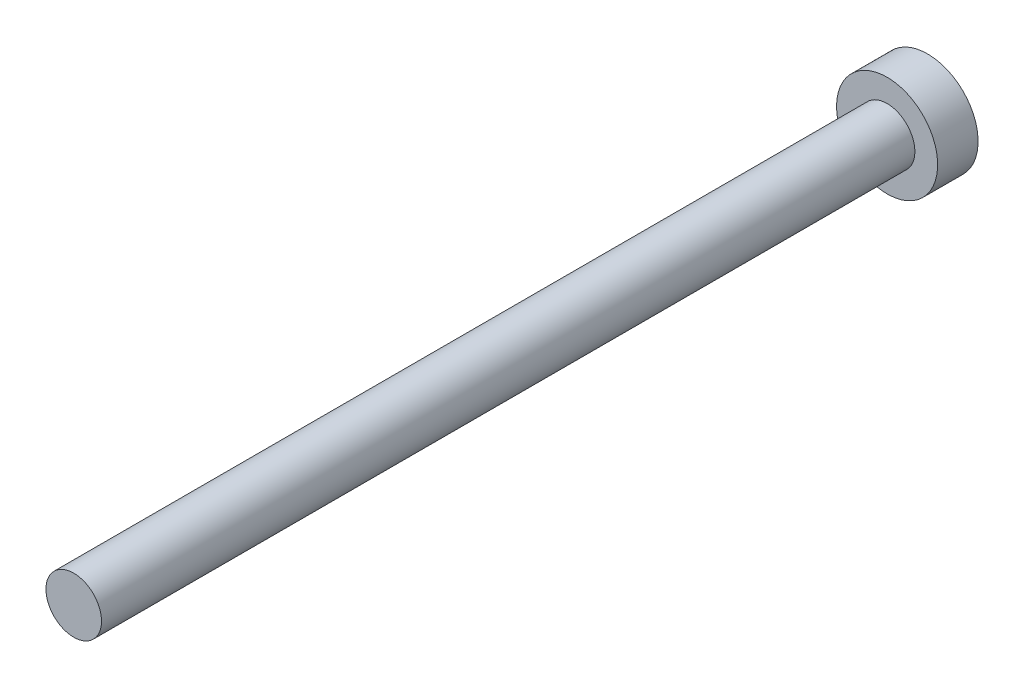
ISO-10303-21;
HEADER;
FILE_DESCRIPTION(('STEP AP214'),'2;1');
FILE_NAME('part.step','',(''),(''),'','','');
FILE_SCHEMA(('AUTOMOTIVE_DESIGN { 1 0 10303 214 1 1 1 1 }'));
ENDSEC;
DATA;
#1=APPLICATION_CONTEXT('core data for automotive mechanical design processes');
#2=APPLICATION_PROTOCOL_DEFINITION('international standard','automotive_design',2000,#1);
#3=PRODUCT_CONTEXT('',#1,'mechanical');
#4=PRODUCT('Part','Part','',(#3));
#5=PRODUCT_RELATED_PRODUCT_CATEGORY('part','',(#4));
#6=PRODUCT_DEFINITION_FORMATION('','',#4);
#7=PRODUCT_DEFINITION_CONTEXT('part definition',#1,'design');
#8=PRODUCT_DEFINITION('design','',#6,#7);
#9=PRODUCT_DEFINITION_SHAPE('','',#8);
#10=(LENGTH_UNIT() NAMED_UNIT(*) SI_UNIT(.MILLI.,.METRE.));
#11=(NAMED_UNIT(*) PLANE_ANGLE_UNIT() SI_UNIT($,.RADIAN.));
#12=(NAMED_UNIT(*) SI_UNIT($,.STERADIAN.) SOLID_ANGLE_UNIT());
#13=UNCERTAINTY_MEASURE_WITH_UNIT(LENGTH_MEASURE(1.E-05),#10,'distance_accuracy_value','');
#14=(GEOMETRIC_REPRESENTATION_CONTEXT(3) GLOBAL_UNCERTAINTY_ASSIGNED_CONTEXT((#13)) GLOBAL_UNIT_ASSIGNED_CONTEXT((#10,
#11,#12)) REPRESENTATION_CONTEXT('',''));
#15=CARTESIAN_POINT('',(0.,0.,0.));
#16=DIRECTION('',(0.,0.,1.));
#17=DIRECTION('',(1.,0.,0.));
#18=AXIS2_PLACEMENT_3D('',#15,#16,#17);
#19=CARTESIAN_POINT('',(0.,0.,4.95));
#20=DIRECTION('',(0.,0.,-1.));
#21=DIRECTION('',(-1.,0.,0.));
#22=AXIS2_PLACEMENT_3D('',#19,#20,#21);
#23=CYLINDRICAL_SURFACE('',#22,6.1875);
#24=CARTESIAN_POINT('',(0.,0.,4.95));
#25=DIRECTION('',(0.,0.,-1.));
#26=DIRECTION('',(-1.,0.,0.));
#27=AXIS2_PLACEMENT_3D('',#24,#25,#26);
#28=CIRCLE('',#27,6.1875);
#29=CARTESIAN_POINT('',(-6.1875,0.,4.95));
#30=VERTEX_POINT('',#29);
#31=EDGE_CURVE('E10',#30,#30,#28,.T.);
#32=ORIENTED_EDGE('',*,*,#31,.T.);
#33=EDGE_LOOP('',(#32));
#34=FACE_BOUND('',#33,.T.);
#35=CARTESIAN_POINT('',(0.,0.,0.));
#36=DIRECTION('',(0.,0.,-1.));
#37=DIRECTION('',(-1.,0.,0.));
#38=AXIS2_PLACEMENT_3D('',#35,#36,#37);
#39=CIRCLE('',#38,6.1875);
#40=CARTESIAN_POINT('',(-6.1875,0.,0.));
#41=VERTEX_POINT('',#40);
#42=EDGE_CURVE('E51',#41,#41,#39,.T.);
#43=ORIENTED_EDGE('',*,*,#42,.F.);
#44=EDGE_LOOP('',(#43));
#45=FACE_BOUND('',#44,.T.);
#46=ADVANCED_FACE('F47',(#34,#45),#23,.T.);
#47=CARTESIAN_POINT('',(0.,0.,4.95));
#48=DIRECTION('',(0.,0.,-1.));
#49=DIRECTION('',(-1.,0.,0.));
#50=AXIS2_PLACEMENT_3D('',#47,#48,#49);
#51=PLANE('',#50);
#52=CARTESIAN_POINT('',(0.,0.,4.95));
#53=DIRECTION('',(0.,0.,-1.));
#54=DIRECTION('',(-1.,0.,0.));
#55=AXIS2_PLACEMENT_3D('',#52,#53,#54);
#56=CIRCLE('',#55,3.4);
#57=CARTESIAN_POINT('',(-3.4,0.,4.95));
#58=VERTEX_POINT('',#57);
#59=EDGE_CURVE('E58',#58,#58,#56,.F.);
#60=ORIENTED_EDGE('',*,*,#59,.F.);
#61=EDGE_LOOP('',(#60));
#62=FACE_BOUND('',#61,.T.);
#63=ORIENTED_EDGE('',*,*,#31,.F.);
#64=EDGE_LOOP('',(#63));
#65=FACE_BOUND('',#64,.T.);
#66=ADVANCED_FACE('F78',(#62,#65),#51,.F.);
#67=CARTESIAN_POINT('',(0.,0.,0.));
#68=DIRECTION('',(0.,0.,1.));
#69=DIRECTION('',(1.,0.,0.));
#70=AXIS2_PLACEMENT_3D('',#67,#68,#69);
#71=PLANE('',#70);
#72=ORIENTED_EDGE('',*,*,#42,.T.);
#73=EDGE_LOOP('',(#72));
#74=FACE_BOUND('',#73,.T.);
#75=ADVANCED_FACE('F49',(#74),#71,.F.);
#76=CARTESIAN_POINT('',(0.,0.,-0.002000000000002));
#77=DIRECTION('',(0.,0.,1.));
#78=DIRECTION('',(1.,0.,0.));
#79=AXIS2_PLACEMENT_3D('',#76,#77,#78);
#80=CYLINDRICAL_SURFACE('',#79,3.4);
#81=ORIENTED_EDGE('',*,*,#59,.T.);
#82=EDGE_LOOP('',(#81));
#83=FACE_BOUND('',#82,.T.);
#84=CARTESIAN_POINT('',(0.,0.,104.5));
#85=DIRECTION('',(0.,0.,1.));
#86=DIRECTION('',(1.,0.,0.));
#87=AXIS2_PLACEMENT_3D('',#84,#85,#86);
#88=CIRCLE('',#87,3.4);
#89=CARTESIAN_POINT('',(3.4,0.,104.5));
#90=VERTEX_POINT('',#89);
#91=EDGE_CURVE('E62',#90,#90,#88,.T.);
#92=ORIENTED_EDGE('',*,*,#91,.F.);
#93=EDGE_LOOP('',(#92));
#94=FACE_BOUND('',#93,.T.);
#95=ADVANCED_FACE('F68',(#83,#94),#80,.T.);
#96=CARTESIAN_POINT('',(0.,0.,104.5));
#97=DIRECTION('',(0.,0.,1.));
#98=DIRECTION('',(1.,0.,0.));
#99=AXIS2_PLACEMENT_3D('',#96,#97,#98);
#100=PLANE('',#99);
#101=ORIENTED_EDGE('',*,*,#91,.T.);
#102=EDGE_LOOP('',(#101));
#103=FACE_BOUND('',#102,.T.);
#104=ADVANCED_FACE('F66',(#103),#100,.T.);
#105=CLOSED_SHELL('',(#46,#66,#75,#95,#104));
#106=MANIFOLD_SOLID_BREP('B2',#105);
#107=ADVANCED_BREP_SHAPE_REPRESENTATION('',(#18,#106),#14);
#108=SHAPE_DEFINITION_REPRESENTATION(#9,#107);
ENDSEC;
END-ISO-10303-21;
